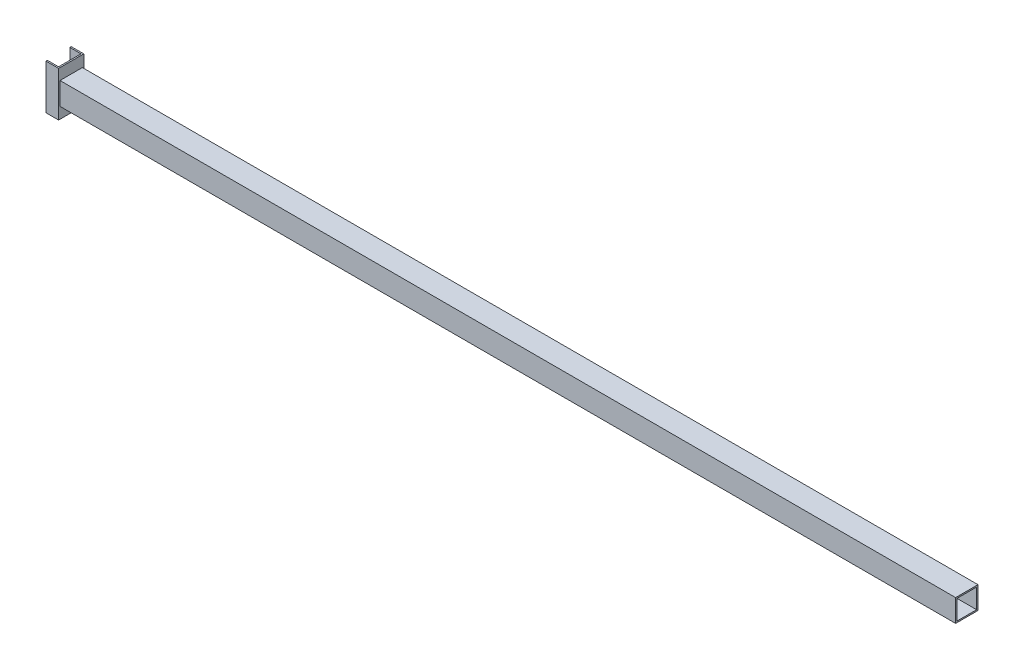
ISO-10303-21;
HEADER;
FILE_DESCRIPTION(('STEP AP214'),'2;1');
FILE_NAME('part.step','',(''),(''),'','','');
FILE_SCHEMA(('AUTOMOTIVE_DESIGN { 1 0 10303 214 1 1 1 1 }'));
ENDSEC;
DATA;
#1=APPLICATION_CONTEXT('core data for automotive mechanical design processes');
#2=APPLICATION_PROTOCOL_DEFINITION('international standard','automotive_design',2000,#1);
#3=PRODUCT_CONTEXT('',#1,'mechanical');
#4=PRODUCT('Part','Part','',(#3));
#5=PRODUCT_RELATED_PRODUCT_CATEGORY('part','',(#4));
#6=PRODUCT_DEFINITION_FORMATION('','',#4);
#7=PRODUCT_DEFINITION_CONTEXT('part definition',#1,'design');
#8=PRODUCT_DEFINITION('design','',#6,#7);
#9=PRODUCT_DEFINITION_SHAPE('','',#8);
#10=(LENGTH_UNIT() NAMED_UNIT(*) SI_UNIT(.MILLI.,.METRE.));
#11=(NAMED_UNIT(*) PLANE_ANGLE_UNIT() SI_UNIT($,.RADIAN.));
#12=(NAMED_UNIT(*) SI_UNIT($,.STERADIAN.) SOLID_ANGLE_UNIT());
#13=UNCERTAINTY_MEASURE_WITH_UNIT(LENGTH_MEASURE(1.E-05),#10,'distance_accuracy_value','');
#14=(GEOMETRIC_REPRESENTATION_CONTEXT(3) GLOBAL_UNCERTAINTY_ASSIGNED_CONTEXT((#13)) GLOBAL_UNIT_ASSIGNED_CONTEXT((#10,
#11,#12)) REPRESENTATION_CONTEXT('',''));
#15=CARTESIAN_POINT('',(0.,0.,0.));
#16=DIRECTION('',(0.,0.,1.));
#17=DIRECTION('',(1.,0.,0.));
#18=AXIS2_PLACEMENT_3D('',#15,#16,#17);
#19=CARTESIAN_POINT('',(-1.5875,0.,0.));
#20=DIRECTION('',(1.,0.,0.));
#21=DIRECTION('',(0.,0.,-1.));
#22=AXIS2_PLACEMENT_3D('',#19,#20,#21);
#23=PLANE('',#22);
#24=DIRECTION('',(0.,0.,1.));
#25=VECTOR('',#24,1.);
#26=CARTESIAN_POINT('',(-1.5875,19.05,-6.35000000000001));
#27=LINE('',#26,#25);
#28=CARTESIAN_POINT('',(-1.5875,19.05,-6.35000000000001));
#29=VERTEX_POINT('',#28);
#30=CARTESIAN_POINT('',(-1.5875,19.05,6.34999999999999));
#31=VERTEX_POINT('',#30);
#32=EDGE_CURVE('E215',#29,#31,#27,.T.);
#33=ORIENTED_EDGE('',*,*,#32,.T.);
#34=DIRECTION('',(0.,-1.,0.));
#35=VECTOR('',#34,1.);
#36=CARTESIAN_POINT('',(-1.5875,19.05,6.34999999999999));
#37=LINE('',#36,#35);
#38=CARTESIAN_POINT('',(-1.5875,12.7,6.34999999999999));
#39=VERTEX_POINT('',#38);
#40=EDGE_CURVE('E230',#31,#39,#37,.T.);
#41=ORIENTED_EDGE('',*,*,#40,.T.);
#42=DIRECTION('',(0.,0.,1.));
#43=VECTOR('',#42,1.);
#44=CARTESIAN_POINT('',(-1.5875,12.7,-6.35000000000001));
#45=LINE('',#44,#43);
#46=CARTESIAN_POINT('',(-1.5875,12.7,-6.35000000000001));
#47=VERTEX_POINT('',#46);
#48=EDGE_CURVE('E233',#47,#39,#45,.T.);
#49=ORIENTED_EDGE('',*,*,#48,.F.);
#50=DIRECTION('',(0.,-1.,0.));
#51=VECTOR('',#50,1.);
#52=CARTESIAN_POINT('',(-1.5875,19.05,-6.35000000000001));
#53=LINE('',#52,#51);
#54=EDGE_CURVE('E226',#29,#47,#53,.T.);
#55=ORIENTED_EDGE('',*,*,#54,.F.);
#56=EDGE_LOOP('',(#33,#41,#49,#55));
#57=FACE_BOUND('',#56,.T.);
#58=DIRECTION('',(0.,0.,-1.));
#59=VECTOR('',#58,1.);
#60=CARTESIAN_POINT('',(-1.5875,25.4,0.));
#61=LINE('',#60,#59);
#62=CARTESIAN_POINT('',(-1.5875,25.4,12.7));
#63=VERTEX_POINT('',#62);
#64=CARTESIAN_POINT('',(-1.5875,25.4,-12.7));
#65=VERTEX_POINT('',#64);
#66=EDGE_CURVE('E366',#63,#65,#61,.T.);
#67=ORIENTED_EDGE('',*,*,#66,.T.);
#68=DIRECTION('',(0.,-1.,0.));
#69=VECTOR('',#68,1.);
#70=CARTESIAN_POINT('',(-1.5875,0.,-12.7));
#71=LINE('',#70,#69);
#72=CARTESIAN_POINT('',(-1.5875,-25.4,-12.7));
#73=VERTEX_POINT('',#72);
#74=EDGE_CURVE('E337',#65,#73,#71,.T.);
#75=ORIENTED_EDGE('',*,*,#74,.T.);
#76=DIRECTION('',(0.,0.,-1.));
#77=VECTOR('',#76,1.);
#78=CARTESIAN_POINT('',(-1.5875,-25.4,0.));
#79=LINE('',#78,#77);
#80=CARTESIAN_POINT('',(-1.5875,-25.4,12.7));
#81=VERTEX_POINT('',#80);
#82=EDGE_CURVE('E363',#81,#73,#79,.T.);
#83=ORIENTED_EDGE('',*,*,#82,.F.);
#84=DIRECTION('',(0.,-1.,0.));
#85=VECTOR('',#84,1.);
#86=CARTESIAN_POINT('',(-1.5875,0.,12.7));
#87=LINE('',#86,#85);
#88=EDGE_CURVE('E357',#63,#81,#87,.T.);
#89=ORIENTED_EDGE('',*,*,#88,.F.);
#90=EDGE_LOOP('',(#67,#75,#83,#89));
#91=FACE_BOUND('',#90,.T.);
#92=DIRECTION('',(0.,0.,1.));
#93=VECTOR('',#92,1.);
#94=CARTESIAN_POINT('',(-1.5875,-6.35,-6.35000000000001));
#95=LINE('',#94,#93);
#96=CARTESIAN_POINT('',(-1.5875,-6.35,-6.35000000000002));
#97=VERTEX_POINT('',#96);
#98=CARTESIAN_POINT('',(-1.5875,-6.35,6.34999999999998));
#99=VERTEX_POINT('',#98);
#100=EDGE_CURVE('E55',#97,#99,#95,.T.);
#101=ORIENTED_EDGE('',*,*,#100,.T.);
#102=DIRECTION('',(0.,-1.,0.));
#103=VECTOR('',#102,1.);
#104=CARTESIAN_POINT('',(-1.5875,-6.35,6.34999999999999));
#105=LINE('',#104,#103);
#106=CARTESIAN_POINT('',(-1.5875,-12.7,6.34999999999999));
#107=VERTEX_POINT('',#106);
#108=EDGE_CURVE('E185',#99,#107,#105,.T.);
#109=ORIENTED_EDGE('',*,*,#108,.T.);
#110=DIRECTION('',(0.,0.,1.));
#111=VECTOR('',#110,1.);
#112=CARTESIAN_POINT('',(-1.5875,-12.7,-6.35000000000001));
#113=LINE('',#112,#111);
#114=CARTESIAN_POINT('',(-1.5875,-12.7,-6.35000000000001));
#115=VERTEX_POINT('',#114);
#116=EDGE_CURVE('E187',#115,#107,#113,.T.);
#117=ORIENTED_EDGE('',*,*,#116,.F.);
#118=DIRECTION('',(0.,-1.,0.));
#119=VECTOR('',#118,1.);
#120=CARTESIAN_POINT('',(-1.5875,-6.35,-6.35000000000001));
#121=LINE('',#120,#119);
#122=EDGE_CURVE('E60',#97,#115,#121,.T.);
#123=ORIENTED_EDGE('',*,*,#122,.F.);
#124=EDGE_LOOP('',(#101,#109,#117,#123));
#125=FACE_BOUND('',#124,.T.);
#126=ADVANCED_FACE('F38',(#57,#91,#125),#23,.F.);
#127=CARTESIAN_POINT('',(0.,0.,0.));
#128=DIRECTION('',(1.,0.,0.));
#129=DIRECTION('',(0.,0.,-1.));
#130=AXIS2_PLACEMENT_3D('',#127,#128,#129);
#131=PLANE('',#130);
#132=DIRECTION('',(0.,0.,-1.));
#133=VECTOR('',#132,1.);
#134=CARTESIAN_POINT('',(0.,12.7,0.));
#135=LINE('',#134,#133);
#136=CARTESIAN_POINT('',(0.,12.7,12.7));
#137=VERTEX_POINT('',#136);
#138=CARTESIAN_POINT('',(0.,12.7,-12.7));
#139=VERTEX_POINT('',#138);
#140=EDGE_CURVE('E229',#137,#139,#135,.T.);
#141=ORIENTED_EDGE('',*,*,#140,.T.);
#142=DIRECTION('',(0.,-1.,0.));
#143=VECTOR('',#142,1.);
#144=CARTESIAN_POINT('',(0.,0.,-12.7));
#145=LINE('',#144,#143);
#146=CARTESIAN_POINT('',(0.,-12.7,-12.7));
#147=VERTEX_POINT('',#146);
#148=EDGE_CURVE('E288',#139,#147,#145,.T.);
#149=ORIENTED_EDGE('',*,*,#148,.T.);
#150=DIRECTION('',(0.,0.,-1.));
#151=VECTOR('',#150,1.);
#152=CARTESIAN_POINT('',(0.,-12.7,0.));
#153=LINE('',#152,#151);
#154=CARTESIAN_POINT('',(0.,-12.7,12.7));
#155=VERTEX_POINT('',#154);
#156=EDGE_CURVE('E285',#155,#147,#153,.T.);
#157=ORIENTED_EDGE('',*,*,#156,.F.);
#158=DIRECTION('',(0.,-1.,0.));
#159=VECTOR('',#158,1.);
#160=CARTESIAN_POINT('',(0.,0.,12.7));
#161=LINE('',#160,#159);
#162=EDGE_CURVE('E282',#137,#155,#161,.T.);
#163=ORIENTED_EDGE('',*,*,#162,.F.);
#164=EDGE_LOOP('',(#141,#149,#157,#163));
#165=FACE_BOUND('',#164,.T.);
#166=DIRECTION('',(0.,0.,-1.));
#167=VECTOR('',#166,1.);
#168=CARTESIAN_POINT('',(0.,-25.4,0.));
#169=LINE('',#168,#167);
#170=CARTESIAN_POINT('',(0.,-25.4,14.2875));
#171=VERTEX_POINT('',#170);
#172=CARTESIAN_POINT('',(0.,-25.4,-14.2875));
#173=VERTEX_POINT('',#172);
#174=EDGE_CURVE('E372',#171,#173,#169,.T.);
#175=ORIENTED_EDGE('',*,*,#174,.T.);
#176=DIRECTION('',(0.,1.,0.));
#177=VECTOR('',#176,1.);
#178=CARTESIAN_POINT('',(0.,0.,-14.2875));
#179=LINE('',#178,#177);
#180=CARTESIAN_POINT('',(0.,25.4,-14.2875));
#181=VERTEX_POINT('',#180);
#182=EDGE_CURVE('E374',#173,#181,#179,.T.);
#183=ORIENTED_EDGE('',*,*,#182,.T.);
#184=DIRECTION('',(0.,0.,-1.));
#185=VECTOR('',#184,1.);
#186=CARTESIAN_POINT('',(0.,25.4,0.));
#187=LINE('',#186,#185);
#188=CARTESIAN_POINT('',(0.,25.4,14.2875));
#189=VERTEX_POINT('',#188);
#190=EDGE_CURVE('E367',#189,#181,#187,.T.);
#191=ORIENTED_EDGE('',*,*,#190,.F.);
#192=DIRECTION('',(0.,1.,0.));
#193=VECTOR('',#192,1.);
#194=CARTESIAN_POINT('',(0.,0.,14.2875));
#195=LINE('',#194,#193);
#196=EDGE_CURVE('E362',#171,#189,#195,.T.);
#197=ORIENTED_EDGE('',*,*,#196,.F.);
#198=EDGE_LOOP('',(#175,#183,#191,#197));
#199=FACE_BOUND('',#198,.T.);
#200=ADVANCED_FACE('F389',(#165,#199),#131,.T.);
#201=CARTESIAN_POINT('',(-1.5875,0.,14.2875));
#202=DIRECTION('',(0.,0.,-1.));
#203=DIRECTION('',(-1.,0.,0.));
#204=AXIS2_PLACEMENT_3D('',#201,#202,#203);
#205=PLANE('',#204);
#206=ORIENTED_EDGE('',*,*,#196,.T.);
#207=DIRECTION('',(1.,0.,0.));
#208=VECTOR('',#207,1.);
#209=CARTESIAN_POINT('',(-1.5875,25.4,14.2875));
#210=LINE('',#209,#208);
#211=CARTESIAN_POINT('',(-14.2875,25.4,14.2875));
#212=VERTEX_POINT('',#211);
#213=EDGE_CURVE('E12',#212,#189,#210,.T.);
#214=ORIENTED_EDGE('',*,*,#213,.F.);
#215=DIRECTION('',(0.,1.,0.));
#216=VECTOR('',#215,1.);
#217=CARTESIAN_POINT('',(-14.2875,0.,14.2875));
#218=LINE('',#217,#216);
#219=CARTESIAN_POINT('',(-14.2875,-25.4,14.2875));
#220=VERTEX_POINT('',#219);
#221=EDGE_CURVE('E345',#220,#212,#218,.T.);
#222=ORIENTED_EDGE('',*,*,#221,.F.);
#223=DIRECTION('',(1.,0.,0.));
#224=VECTOR('',#223,1.);
#225=CARTESIAN_POINT('',(-1.5875,-25.4,14.2875));
#226=LINE('',#225,#224);
#227=EDGE_CURVE('E42',#220,#171,#226,.T.);
#228=ORIENTED_EDGE('',*,*,#227,.T.);
#229=EDGE_LOOP('',(#206,#214,#222,#228));
#230=FACE_BOUND('',#229,.T.);
#231=ADVANCED_FACE('F40',(#230),#205,.F.);
#232=CARTESIAN_POINT('',(-1.5875,25.4,0.));
#233=DIRECTION('',(0.,-1.,0.));
#234=DIRECTION('',(0.,0.,-1.));
#235=AXIS2_PLACEMENT_3D('',#232,#233,#234);
#236=PLANE('',#235);
#237=ORIENTED_EDGE('',*,*,#190,.T.);
#238=DIRECTION('',(1.,0.,0.));
#239=VECTOR('',#238,1.);
#240=CARTESIAN_POINT('',(-1.5875,25.4,-14.2875));
#241=LINE('',#240,#239);
#242=CARTESIAN_POINT('',(-14.2875,25.4,-14.2875));
#243=VERTEX_POINT('',#242);
#244=EDGE_CURVE('E47',#243,#181,#241,.T.);
#245=ORIENTED_EDGE('',*,*,#244,.F.);
#246=DIRECTION('',(0.,0.,-1.));
#247=VECTOR('',#246,1.);
#248=CARTESIAN_POINT('',(-14.2875,25.4,0.));
#249=LINE('',#248,#247);
#250=CARTESIAN_POINT('',(-14.2875,25.4,-12.7));
#251=VERTEX_POINT('',#250);
#252=EDGE_CURVE('E312',#251,#243,#249,.T.);
#253=ORIENTED_EDGE('',*,*,#252,.F.);
#254=DIRECTION('',(1.,0.,0.));
#255=VECTOR('',#254,1.);
#256=CARTESIAN_POINT('',(-14.2875,25.4,-12.7));
#257=LINE('',#256,#255);
#258=EDGE_CURVE('E334',#251,#65,#257,.T.);
#259=ORIENTED_EDGE('',*,*,#258,.T.);
#260=ORIENTED_EDGE('',*,*,#66,.F.);
#261=DIRECTION('',(1.,0.,0.));
#262=VECTOR('',#261,1.);
#263=CARTESIAN_POINT('',(-14.2875,25.4,12.7));
#264=LINE('',#263,#262);
#265=CARTESIAN_POINT('',(-14.2875,25.4,12.7));
#266=VERTEX_POINT('',#265);
#267=EDGE_CURVE('E354',#266,#63,#264,.T.);
#268=ORIENTED_EDGE('',*,*,#267,.F.);
#269=DIRECTION('',(0.,0.,-1.));
#270=VECTOR('',#269,1.);
#271=CARTESIAN_POINT('',(-14.2875,25.4,0.));
#272=LINE('',#271,#270);
#273=EDGE_CURVE('E342',#212,#266,#272,.T.);
#274=ORIENTED_EDGE('',*,*,#273,.F.);
#275=ORIENTED_EDGE('',*,*,#213,.T.);
#276=EDGE_LOOP('',(#237,#245,#253,#259,#260,#268,#274,#275));
#277=FACE_BOUND('',#276,.T.);
#278=ADVANCED_FACE('F401',(#277),#236,.F.);
#279=CARTESIAN_POINT('',(-1.5875,0.,-14.2875));
#280=DIRECTION('',(0.,0.,-1.));
#281=DIRECTION('',(-1.,0.,0.));
#282=AXIS2_PLACEMENT_3D('',#279,#280,#281);
#283=PLANE('',#282);
#284=ORIENTED_EDGE('',*,*,#182,.F.);
#285=DIRECTION('',(1.,0.,0.));
#286=VECTOR('',#285,1.);
#287=CARTESIAN_POINT('',(-1.5875,-25.4,-14.2875));
#288=LINE('',#287,#286);
#289=CARTESIAN_POINT('',(-14.2875,-25.4,-14.2875));
#290=VERTEX_POINT('',#289);
#291=EDGE_CURVE('E379',#290,#173,#288,.T.);
#292=ORIENTED_EDGE('',*,*,#291,.F.);
#293=DIRECTION('',(0.,1.,0.));
#294=VECTOR('',#293,1.);
#295=CARTESIAN_POINT('',(-14.2875,0.,-14.2875));
#296=LINE('',#295,#294);
#297=EDGE_CURVE('E331',#290,#243,#296,.T.);
#298=ORIENTED_EDGE('',*,*,#297,.T.);
#299=ORIENTED_EDGE('',*,*,#244,.T.);
#300=EDGE_LOOP('',(#284,#292,#298,#299));
#301=FACE_BOUND('',#300,.T.);
#302=ADVANCED_FACE('F393',(#301),#283,.T.);
#303=CARTESIAN_POINT('',(-1.5875,-25.4,0.));
#304=DIRECTION('',(0.,-1.,0.));
#305=DIRECTION('',(0.,0.,-1.));
#306=AXIS2_PLACEMENT_3D('',#303,#304,#305);
#307=PLANE('',#306);
#308=ORIENTED_EDGE('',*,*,#82,.T.);
#309=DIRECTION('',(1.,0.,0.));
#310=VECTOR('',#309,1.);
#311=CARTESIAN_POINT('',(-14.2875,-25.4,-12.7));
#312=LINE('',#311,#310);
#313=CARTESIAN_POINT('',(-14.2875,-25.4,-12.7));
#314=VERTEX_POINT('',#313);
#315=EDGE_CURVE('E335',#314,#73,#312,.T.);
#316=ORIENTED_EDGE('',*,*,#315,.F.);
#317=DIRECTION('',(0.,0.,-1.));
#318=VECTOR('',#317,1.);
#319=CARTESIAN_POINT('',(-14.2875,-25.4,0.));
#320=LINE('',#319,#318);
#321=EDGE_CURVE('E328',#314,#290,#320,.T.);
#322=ORIENTED_EDGE('',*,*,#321,.T.);
#323=ORIENTED_EDGE('',*,*,#291,.T.);
#324=ORIENTED_EDGE('',*,*,#174,.F.);
#325=ORIENTED_EDGE('',*,*,#227,.F.);
#326=DIRECTION('',(0.,0.,-1.));
#327=VECTOR('',#326,1.);
#328=CARTESIAN_POINT('',(-14.2875,-25.4,0.));
#329=LINE('',#328,#327);
#330=CARTESIAN_POINT('',(-14.2875,-25.4,12.7));
#331=VERTEX_POINT('',#330);
#332=EDGE_CURVE('E348',#220,#331,#329,.T.);
#333=ORIENTED_EDGE('',*,*,#332,.T.);
#334=DIRECTION('',(1.,0.,0.));
#335=VECTOR('',#334,1.);
#336=CARTESIAN_POINT('',(-14.2875,-25.4,12.7));
#337=LINE('',#336,#335);
#338=EDGE_CURVE('E353',#331,#81,#337,.T.);
#339=ORIENTED_EDGE('',*,*,#338,.T.);
#340=EDGE_LOOP('',(#308,#316,#322,#323,#324,#325,#333,#339));
#341=FACE_BOUND('',#340,.T.);
#342=ADVANCED_FACE('F390',(#341),#307,.T.);
#343=CARTESIAN_POINT('',(-14.2875,0.,12.7));
#344=DIRECTION('',(0.,0.,1.));
#345=DIRECTION('',(0.,-1.,0.));
#346=AXIS2_PLACEMENT_3D('',#343,#344,#345);
#347=PLANE('',#346);
#348=ORIENTED_EDGE('',*,*,#267,.T.);
#349=ORIENTED_EDGE('',*,*,#88,.T.);
#350=ORIENTED_EDGE('',*,*,#338,.F.);
#351=DIRECTION('',(0.,-1.,0.));
#352=VECTOR('',#351,1.);
#353=CARTESIAN_POINT('',(-14.2875,0.,12.7));
#354=LINE('',#353,#352);
#355=EDGE_CURVE('E351',#266,#331,#354,.T.);
#356=ORIENTED_EDGE('',*,*,#355,.F.);
#357=EDGE_LOOP('',(#348,#349,#350,#356));
#358=FACE_BOUND('',#357,.T.);
#359=ADVANCED_FACE('F392',(#358),#347,.F.);
#360=CARTESIAN_POINT('',(-14.2875,0.,0.));
#361=DIRECTION('',(1.,0.,0.));
#362=DIRECTION('',(0.,0.,-1.));
#363=AXIS2_PLACEMENT_3D('',#360,#361,#362);
#364=PLANE('',#363);
#365=ORIENTED_EDGE('',*,*,#273,.T.);
#366=ORIENTED_EDGE('',*,*,#355,.T.);
#367=ORIENTED_EDGE('',*,*,#332,.F.);
#368=ORIENTED_EDGE('',*,*,#221,.T.);
#369=EDGE_LOOP('',(#365,#366,#367,#368));
#370=FACE_BOUND('',#369,.T.);
#371=ADVANCED_FACE('F398',(#370),#364,.F.);
#372=CARTESIAN_POINT('',(-14.2875,0.,-12.7));
#373=DIRECTION('',(0.,0.,1.));
#374=DIRECTION('',(0.,-1.,0.));
#375=AXIS2_PLACEMENT_3D('',#372,#373,#374);
#376=PLANE('',#375);
#377=ORIENTED_EDGE('',*,*,#74,.F.);
#378=ORIENTED_EDGE('',*,*,#258,.F.);
#379=DIRECTION('',(0.,-1.,0.));
#380=VECTOR('',#379,1.);
#381=CARTESIAN_POINT('',(-14.2875,0.,-12.7));
#382=LINE('',#381,#380);
#383=EDGE_CURVE('E325',#251,#314,#382,.T.);
#384=ORIENTED_EDGE('',*,*,#383,.T.);
#385=ORIENTED_EDGE('',*,*,#315,.T.);
#386=EDGE_LOOP('',(#377,#378,#384,#385));
#387=FACE_BOUND('',#386,.T.);
#388=ADVANCED_FACE('F439',(#387),#376,.T.);
#389=CARTESIAN_POINT('',(-14.2875,0.,0.));
#390=DIRECTION('',(1.,0.,0.));
#391=DIRECTION('',(0.,0.,-1.));
#392=AXIS2_PLACEMENT_3D('',#389,#390,#391);
#393=PLANE('',#392);
#394=ORIENTED_EDGE('',*,*,#252,.T.);
#395=ORIENTED_EDGE('',*,*,#297,.F.);
#396=ORIENTED_EDGE('',*,*,#321,.F.);
#397=ORIENTED_EDGE('',*,*,#383,.F.);
#398=EDGE_LOOP('',(#394,#395,#396,#397));
#399=FACE_BOUND('',#398,.T.);
#400=ADVANCED_FACE('F431',(#399),#393,.F.);
#401=CARTESIAN_POINT('',(1016.,-11.1125,0.));
#402=DIRECTION('',(0.,1.,0.));
#403=DIRECTION('',(0.,0.,1.));
#404=AXIS2_PLACEMENT_3D('',#401,#402,#403);
#405=PLANE('',#404);
#406=DIRECTION('',(0.,0.,-1.));
#407=VECTOR('',#406,1.);
#408=CARTESIAN_POINT('',(0.,-11.1125,0.));
#409=LINE('',#408,#407);
#410=CARTESIAN_POINT('',(0.,-11.1125,11.1125));
#411=VERTEX_POINT('',#410);
#412=CARTESIAN_POINT('',(0.,-11.1125,-11.1125));
#413=VERTEX_POINT('',#412);
#414=EDGE_CURVE('E290',#411,#413,#409,.T.);
#415=ORIENTED_EDGE('',*,*,#414,.F.);
#416=DIRECTION('',(-1.,0.,0.));
#417=VECTOR('',#416,1.);
#418=CARTESIAN_POINT('',(1016.,-11.1125,11.1125));
#419=LINE('',#418,#417);
#420=CARTESIAN_POINT('',(1016.,-11.1125,11.1125));
#421=VERTEX_POINT('',#420);
#422=EDGE_CURVE('E309',#421,#411,#419,.T.);
#423=ORIENTED_EDGE('',*,*,#422,.F.);
#424=DIRECTION('',(0.,0.,-1.));
#425=VECTOR('',#424,1.);
#426=CARTESIAN_POINT('',(1016.,-11.1125,0.));
#427=LINE('',#426,#425);
#428=CARTESIAN_POINT('',(1016.,-11.1125,-11.1125));
#429=VERTEX_POINT('',#428);
#430=EDGE_CURVE('E269',#421,#429,#427,.T.);
#431=ORIENTED_EDGE('',*,*,#430,.T.);
#432=DIRECTION('',(-1.,0.,0.));
#433=VECTOR('',#432,1.);
#434=CARTESIAN_POINT('',(1016.,-11.1125,-11.1125));
#435=LINE('',#434,#433);
#436=EDGE_CURVE('E299',#429,#413,#435,.T.);
#437=ORIENTED_EDGE('',*,*,#436,.T.);
#438=EDGE_LOOP('',(#415,#423,#431,#437));
#439=FACE_BOUND('',#438,.T.);
#440=ADVANCED_FACE('F447',(#439),#405,.T.);
#441=CARTESIAN_POINT('',(1016.,0.,11.1125));
#442=DIRECTION('',(0.,0.,1.));
#443=DIRECTION('',(1.,0.,0.));
#444=AXIS2_PLACEMENT_3D('',#441,#442,#443);
#445=PLANE('',#444);
#446=DIRECTION('',(0.,1.,0.));
#447=VECTOR('',#446,1.);
#448=CARTESIAN_POINT('',(0.,0.,11.1125));
#449=LINE('',#448,#447);
#450=CARTESIAN_POINT('',(0.,11.1125,11.1125));
#451=VERTEX_POINT('',#450);
#452=EDGE_CURVE('E292',#411,#451,#449,.T.);
#453=ORIENTED_EDGE('',*,*,#452,.T.);
#454=DIRECTION('',(-1.,0.,0.));
#455=VECTOR('',#454,1.);
#456=CARTESIAN_POINT('',(1016.,11.1125,11.1125));
#457=LINE('',#456,#455);
#458=CARTESIAN_POINT('',(1016.,11.1125,11.1125));
#459=VERTEX_POINT('',#458);
#460=EDGE_CURVE('E306',#459,#451,#457,.T.);
#461=ORIENTED_EDGE('',*,*,#460,.F.);
#462=DIRECTION('',(0.,1.,0.));
#463=VECTOR('',#462,1.);
#464=CARTESIAN_POINT('',(1016.,0.,11.1125));
#465=LINE('',#464,#463);
#466=EDGE_CURVE('E272',#421,#459,#465,.T.);
#467=ORIENTED_EDGE('',*,*,#466,.F.);
#468=ORIENTED_EDGE('',*,*,#422,.T.);
#469=EDGE_LOOP('',(#453,#461,#467,#468));
#470=FACE_BOUND('',#469,.T.);
#471=ADVANCED_FACE('F468',(#470),#445,.F.);
#472=CARTESIAN_POINT('',(1016.,11.1125,0.));
#473=DIRECTION('',(0.,1.,0.));
#474=DIRECTION('',(0.,0.,1.));
#475=AXIS2_PLACEMENT_3D('',#472,#473,#474);
#476=PLANE('',#475);
#477=DIRECTION('',(0.,0.,-1.));
#478=VECTOR('',#477,1.);
#479=CARTESIAN_POINT('',(0.,11.1125,0.));
#480=LINE('',#479,#478);
#481=CARTESIAN_POINT('',(0.,11.1125,-11.1125));
#482=VERTEX_POINT('',#481);
#483=EDGE_CURVE('E295',#451,#482,#480,.T.);
#484=ORIENTED_EDGE('',*,*,#483,.T.);
#485=DIRECTION('',(-1.,0.,0.));
#486=VECTOR('',#485,1.);
#487=CARTESIAN_POINT('',(1016.,11.1125,-11.1125));
#488=LINE('',#487,#486);
#489=CARTESIAN_POINT('',(1016.,11.1125,-11.1125));
#490=VERTEX_POINT('',#489);
#491=EDGE_CURVE('E302',#490,#482,#488,.T.);
#492=ORIENTED_EDGE('',*,*,#491,.F.);
#493=DIRECTION('',(0.,0.,-1.));
#494=VECTOR('',#493,1.);
#495=CARTESIAN_POINT('',(1016.,11.1125,0.));
#496=LINE('',#495,#494);
#497=EDGE_CURVE('E275',#459,#490,#496,.T.);
#498=ORIENTED_EDGE('',*,*,#497,.F.);
#499=ORIENTED_EDGE('',*,*,#460,.T.);
#500=EDGE_LOOP('',(#484,#492,#498,#499));
#501=FACE_BOUND('',#500,.T.);
#502=ADVANCED_FACE('F452',(#501),#476,.F.);
#503=CARTESIAN_POINT('',(1016.,12.7,0.));
#504=DIRECTION('',(0.,1.,0.));
#505=DIRECTION('',(0.,0.,1.));
#506=AXIS2_PLACEMENT_3D('',#503,#504,#505);
#507=PLANE('',#506);
#508=ORIENTED_EDGE('',*,*,#140,.F.);
#509=DIRECTION('',(-1.,0.,0.));
#510=VECTOR('',#509,1.);
#511=CARTESIAN_POINT('',(1016.,12.7,12.7));
#512=LINE('',#511,#510);
#513=CARTESIAN_POINT('',(1016.,12.7,12.7));
#514=VERTEX_POINT('',#513);
#515=EDGE_CURVE('E303',#514,#137,#512,.T.);
#516=ORIENTED_EDGE('',*,*,#515,.F.);
#517=DIRECTION('',(0.,0.,-1.));
#518=VECTOR('',#517,1.);
#519=CARTESIAN_POINT('',(1016.,12.7,0.));
#520=LINE('',#519,#518);
#521=CARTESIAN_POINT('',(1016.,12.7,-12.7));
#522=VERTEX_POINT('',#521);
#523=EDGE_CURVE('E258',#514,#522,#520,.T.);
#524=ORIENTED_EDGE('',*,*,#523,.T.);
#525=DIRECTION('',(-1.,0.,0.));
#526=VECTOR('',#525,1.);
#527=CARTESIAN_POINT('',(1016.,12.7,-12.7));
#528=LINE('',#527,#526);
#529=EDGE_CURVE('E280',#522,#139,#528,.T.);
#530=ORIENTED_EDGE('',*,*,#529,.T.);
#531=EDGE_LOOP('',(#508,#516,#524,#530));
#532=FACE_BOUND('',#531,.T.);
#533=ADVANCED_FACE('F448',(#532),#507,.T.);
#534=CARTESIAN_POINT('',(1016.,0.,12.7));
#535=DIRECTION('',(0.,0.,-1.));
#536=DIRECTION('',(0.,1.,0.));
#537=AXIS2_PLACEMENT_3D('',#534,#535,#536);
#538=PLANE('',#537);
#539=ORIENTED_EDGE('',*,*,#162,.T.);
#540=DIRECTION('',(-1.,0.,0.));
#541=VECTOR('',#540,1.);
#542=CARTESIAN_POINT('',(1016.,-12.7,12.7));
#543=LINE('',#542,#541);
#544=CARTESIAN_POINT('',(1016.,-12.7,12.7));
#545=VERTEX_POINT('',#544);
#546=EDGE_CURVE('E318',#545,#155,#543,.T.);
#547=ORIENTED_EDGE('',*,*,#546,.F.);
#548=DIRECTION('',(0.,-1.,0.));
#549=VECTOR('',#548,1.);
#550=CARTESIAN_POINT('',(1016.,0.,12.7));
#551=LINE('',#550,#549);
#552=EDGE_CURVE('E261',#514,#545,#551,.T.);
#553=ORIENTED_EDGE('',*,*,#552,.F.);
#554=ORIENTED_EDGE('',*,*,#515,.T.);
#555=EDGE_LOOP('',(#539,#547,#553,#554));
#556=FACE_BOUND('',#555,.T.);
#557=ADVANCED_FACE('F451',(#556),#538,.F.);
#558=CARTESIAN_POINT('',(1016.,-12.7,0.));
#559=DIRECTION('',(0.,1.,0.));
#560=DIRECTION('',(0.,0.,1.));
#561=AXIS2_PLACEMENT_3D('',#558,#559,#560);
#562=PLANE('',#561);
#563=ORIENTED_EDGE('',*,*,#156,.T.);
#564=DIRECTION('',(-1.,0.,0.));
#565=VECTOR('',#564,1.);
#566=CARTESIAN_POINT('',(1016.,-12.7,-12.7));
#567=LINE('',#566,#565);
#568=CARTESIAN_POINT('',(1016.,-12.7,-12.7));
#569=VERTEX_POINT('',#568);
#570=EDGE_CURVE('E315',#569,#147,#567,.T.);
#571=ORIENTED_EDGE('',*,*,#570,.F.);
#572=DIRECTION('',(0.,0.,-1.));
#573=VECTOR('',#572,1.);
#574=CARTESIAN_POINT('',(1016.,-12.7,0.));
#575=LINE('',#574,#573);
#576=EDGE_CURVE('E264',#545,#569,#575,.T.);
#577=ORIENTED_EDGE('',*,*,#576,.F.);
#578=ORIENTED_EDGE('',*,*,#546,.T.);
#579=EDGE_LOOP('',(#563,#571,#577,#578));
#580=FACE_BOUND('',#579,.T.);
#581=ADVANCED_FACE('F456',(#580),#562,.F.);
#582=CARTESIAN_POINT('',(1016.,0.,-12.7));
#583=DIRECTION('',(0.,0.,-1.));
#584=DIRECTION('',(0.,1.,0.));
#585=AXIS2_PLACEMENT_3D('',#582,#583,#584);
#586=PLANE('',#585);
#587=ORIENTED_EDGE('',*,*,#148,.F.);
#588=ORIENTED_EDGE('',*,*,#529,.F.);
#589=DIRECTION('',(0.,-1.,0.));
#590=VECTOR('',#589,1.);
#591=CARTESIAN_POINT('',(1016.,0.,-12.7));
#592=LINE('',#591,#590);
#593=EDGE_CURVE('E266',#522,#569,#592,.T.);
#594=ORIENTED_EDGE('',*,*,#593,.T.);
#595=ORIENTED_EDGE('',*,*,#570,.T.);
#596=EDGE_LOOP('',(#587,#588,#594,#595));
#597=FACE_BOUND('',#596,.T.);
#598=ADVANCED_FACE('F460',(#597),#586,.T.);
#599=CARTESIAN_POINT('',(1016.,0.,-11.1125));
#600=DIRECTION('',(0.,0.,1.));
#601=DIRECTION('',(1.,0.,0.));
#602=AXIS2_PLACEMENT_3D('',#599,#600,#601);
#603=PLANE('',#602);
#604=DIRECTION('',(0.,1.,0.));
#605=VECTOR('',#604,1.);
#606=CARTESIAN_POINT('',(0.,0.,-11.1125));
#607=LINE('',#606,#605);
#608=EDGE_CURVE('E262',#413,#482,#607,.T.);
#609=ORIENTED_EDGE('',*,*,#608,.F.);
#610=ORIENTED_EDGE('',*,*,#436,.F.);
#611=DIRECTION('',(0.,1.,0.));
#612=VECTOR('',#611,1.);
#613=CARTESIAN_POINT('',(1016.,0.,-11.1125));
#614=LINE('',#613,#612);
#615=EDGE_CURVE('E277',#429,#490,#614,.T.);
#616=ORIENTED_EDGE('',*,*,#615,.T.);
#617=ORIENTED_EDGE('',*,*,#491,.T.);
#618=EDGE_LOOP('',(#609,#610,#616,#617));
#619=FACE_BOUND('',#618,.T.);
#620=ADVANCED_FACE('F464',(#619),#603,.T.);
#621=CARTESIAN_POINT('',(1016.,0.,0.));
#622=DIRECTION('',(1.,0.,0.));
#623=DIRECTION('',(0.,0.,-1.));
#624=AXIS2_PLACEMENT_3D('',#621,#622,#623);
#625=PLANE('',#624);
#626=ORIENTED_EDGE('',*,*,#523,.F.);
#627=ORIENTED_EDGE('',*,*,#552,.T.);
#628=ORIENTED_EDGE('',*,*,#576,.T.);
#629=ORIENTED_EDGE('',*,*,#593,.F.);
#630=EDGE_LOOP('',(#626,#627,#628,#629));
#631=FACE_BOUND('',#630,.T.);
#632=ORIENTED_EDGE('',*,*,#430,.F.);
#633=ORIENTED_EDGE('',*,*,#466,.T.);
#634=ORIENTED_EDGE('',*,*,#497,.T.);
#635=ORIENTED_EDGE('',*,*,#615,.F.);
#636=EDGE_LOOP('',(#632,#633,#634,#635));
#637=FACE_BOUND('',#636,.T.);
#638=ADVANCED_FACE('F418',(#631,#637),#625,.T.);
#639=ORIENTED_EDGE('',*,*,#414,.T.);
#640=ORIENTED_EDGE('',*,*,#608,.T.);
#641=ORIENTED_EDGE('',*,*,#483,.F.);
#642=ORIENTED_EDGE('',*,*,#452,.F.);
#643=EDGE_LOOP('',(#639,#640,#641,#642));
#644=FACE_BOUND('',#643,.T.);
#645=ADVANCED_FACE('F412',(#644),#131,.T.);
#646=CARTESIAN_POINT('',(0.,0.,6.34999999999999));
#647=DIRECTION('',(0.,0.,1.));
#648=DIRECTION('',(1.,0.,0.));
#649=AXIS2_PLACEMENT_3D('',#646,#647,#648);
#650=PLANE('',#649);
#651=ORIENTED_EDGE('',*,*,#40,.F.);
#652=DIRECTION('',(0.447213595499958,0.894427190999916,0.));
#653=VECTOR('',#652,1.);
#654=CARTESIAN_POINT('',(-4.7625,12.7,6.34999999999999));
#655=LINE('',#654,#653);
#656=CARTESIAN_POINT('',(-4.7625,12.7,6.34999999999999));
#657=VERTEX_POINT('',#656);
#658=EDGE_CURVE('E243',#657,#31,#655,.T.);
#659=ORIENTED_EDGE('',*,*,#658,.F.);
#660=DIRECTION('',(-1.,0.,0.));
#661=VECTOR('',#660,1.);
#662=CARTESIAN_POINT('',(-1.5875,12.7,6.34999999999999));
#663=LINE('',#662,#661);
#664=EDGE_CURVE('E217',#39,#657,#663,.T.);
#665=ORIENTED_EDGE('',*,*,#664,.F.);
#666=EDGE_LOOP('',(#651,#659,#665));
#667=FACE_BOUND('',#666,.T.);
#668=ADVANCED_FACE('F417',(#667),#650,.T.);
#669=CARTESIAN_POINT('',(0.,0.,-6.35000000000001));
#670=DIRECTION('',(0.,0.,1.));
#671=DIRECTION('',(1.,0.,0.));
#672=AXIS2_PLACEMENT_3D('',#669,#670,#671);
#673=PLANE('',#672);
#674=ORIENTED_EDGE('',*,*,#54,.T.);
#675=DIRECTION('',(-1.,0.,0.));
#676=VECTOR('',#675,1.);
#677=CARTESIAN_POINT('',(-1.5875,12.7,-6.35000000000001));
#678=LINE('',#677,#676);
#679=CARTESIAN_POINT('',(-4.7625,12.7,-6.35000000000001));
#680=VERTEX_POINT('',#679);
#681=EDGE_CURVE('E236',#47,#680,#678,.T.);
#682=ORIENTED_EDGE('',*,*,#681,.T.);
#683=DIRECTION('',(0.447213595499958,0.894427190999916,0.));
#684=VECTOR('',#683,1.);
#685=CARTESIAN_POINT('',(-4.7625,12.7,-6.35000000000001));
#686=LINE('',#685,#684);
#687=EDGE_CURVE('E218',#680,#29,#686,.T.);
#688=ORIENTED_EDGE('',*,*,#687,.T.);
#689=EDGE_LOOP('',(#674,#682,#688));
#690=FACE_BOUND('',#689,.T.);
#691=ADVANCED_FACE('F484',(#690),#673,.F.);
#692=CARTESIAN_POINT('',(-4.7625,12.7,-6.35000000000001));
#693=DIRECTION('',(0.894427190999916,-0.447213595499958,0.));
#694=DIRECTION('',(0.447213595499958,0.894427190999916,0.));
#695=AXIS2_PLACEMENT_3D('',#692,#693,#694);
#696=PLANE('',#695);
#697=ORIENTED_EDGE('',*,*,#658,.T.);
#698=ORIENTED_EDGE('',*,*,#32,.F.);
#699=ORIENTED_EDGE('',*,*,#687,.F.);
#700=DIRECTION('',(0.,0.,1.));
#701=VECTOR('',#700,1.);
#702=CARTESIAN_POINT('',(-4.7625,12.7,-6.35000000000001));
#703=LINE('',#702,#701);
#704=EDGE_CURVE('E223',#680,#657,#703,.T.);
#705=ORIENTED_EDGE('',*,*,#704,.T.);
#706=EDGE_LOOP('',(#697,#698,#699,#705));
#707=FACE_BOUND('',#706,.T.);
#708=ADVANCED_FACE('F488',(#707),#696,.F.);
#709=CARTESIAN_POINT('',(-1.5875,12.7,-6.35000000000001));
#710=DIRECTION('',(0.,1.,0.));
#711=DIRECTION('',(-1.,0.,0.));
#712=AXIS2_PLACEMENT_3D('',#709,#710,#711);
#713=PLANE('',#712);
#714=ORIENTED_EDGE('',*,*,#664,.T.);
#715=ORIENTED_EDGE('',*,*,#704,.F.);
#716=ORIENTED_EDGE('',*,*,#681,.F.);
#717=ORIENTED_EDGE('',*,*,#48,.T.);
#718=EDGE_LOOP('',(#714,#715,#716,#717));
#719=FACE_BOUND('',#718,.T.);
#720=ADVANCED_FACE('F420',(#719),#713,.F.);
#721=CARTESIAN_POINT('',(0.,0.,6.34999999999998));
#722=DIRECTION('',(0.,0.,1.));
#723=DIRECTION('',(1.,0.,0.));
#724=AXIS2_PLACEMENT_3D('',#721,#722,#723);
#725=PLANE('',#724);
#726=ORIENTED_EDGE('',*,*,#108,.F.);
#727=DIRECTION('',(0.447213595499958,0.894427190999916,0.));
#728=VECTOR('',#727,1.);
#729=CARTESIAN_POINT('',(-4.7625,-12.7,6.34999999999999));
#730=LINE('',#729,#728);
#731=CARTESIAN_POINT('',(-4.7625,-12.7,6.34999999999999));
#732=VERTEX_POINT('',#731);
#733=EDGE_CURVE('E202',#732,#99,#730,.T.);
#734=ORIENTED_EDGE('',*,*,#733,.F.);
#735=DIRECTION('',(-1.,0.,0.));
#736=VECTOR('',#735,1.);
#737=CARTESIAN_POINT('',(-1.5875,-12.7,6.34999999999999));
#738=LINE('',#737,#736);
#739=EDGE_CURVE('E197',#107,#732,#738,.T.);
#740=ORIENTED_EDGE('',*,*,#739,.F.);
#741=EDGE_LOOP('',(#726,#734,#740));
#742=FACE_BOUND('',#741,.T.);
#743=ADVANCED_FACE('F201',(#742),#725,.T.);
#744=CARTESIAN_POINT('',(0.,0.,-6.35000000000002));
#745=DIRECTION('',(0.,0.,1.));
#746=DIRECTION('',(1.,0.,0.));
#747=AXIS2_PLACEMENT_3D('',#744,#745,#746);
#748=PLANE('',#747);
#749=ORIENTED_EDGE('',*,*,#122,.T.);
#750=DIRECTION('',(-1.,0.,0.));
#751=VECTOR('',#750,1.);
#752=CARTESIAN_POINT('',(-1.5875,-12.7,-6.35000000000001));
#753=LINE('',#752,#751);
#754=CARTESIAN_POINT('',(-4.7625,-12.7,-6.35000000000001));
#755=VERTEX_POINT('',#754);
#756=EDGE_CURVE('E192',#115,#755,#753,.T.);
#757=ORIENTED_EDGE('',*,*,#756,.T.);
#758=DIRECTION('',(0.447213595499958,0.894427190999916,0.));
#759=VECTOR('',#758,1.);
#760=CARTESIAN_POINT('',(-4.7625,-12.7,-6.35000000000001));
#761=LINE('',#760,#759);
#762=EDGE_CURVE('E204',#755,#97,#761,.T.);
#763=ORIENTED_EDGE('',*,*,#762,.T.);
#764=EDGE_LOOP('',(#749,#757,#763));
#765=FACE_BOUND('',#764,.T.);
#766=ADVANCED_FACE('F498',(#765),#748,.F.);
#767=CARTESIAN_POINT('',(-4.7625,-12.7,-6.35000000000001));
#768=DIRECTION('',(0.894427190999916,-0.447213595499958,0.));
#769=DIRECTION('',(0.447213595499958,0.894427190999916,0.));
#770=AXIS2_PLACEMENT_3D('',#767,#768,#769);
#771=PLANE('',#770);
#772=ORIENTED_EDGE('',*,*,#733,.T.);
#773=ORIENTED_EDGE('',*,*,#100,.F.);
#774=ORIENTED_EDGE('',*,*,#762,.F.);
#775=DIRECTION('',(0.,0.,1.));
#776=VECTOR('',#775,1.);
#777=CARTESIAN_POINT('',(-4.7625,-12.7,-6.35000000000001));
#778=LINE('',#777,#776);
#779=EDGE_CURVE('E211',#755,#732,#778,.T.);
#780=ORIENTED_EDGE('',*,*,#779,.T.);
#781=EDGE_LOOP('',(#772,#773,#774,#780));
#782=FACE_BOUND('',#781,.T.);
#783=ADVANCED_FACE('F501',(#782),#771,.F.);
#784=CARTESIAN_POINT('',(-1.5875,-12.7,-6.35000000000001));
#785=DIRECTION('',(0.,1.,0.));
#786=DIRECTION('',(-1.,0.,0.));
#787=AXIS2_PLACEMENT_3D('',#784,#785,#786);
#788=PLANE('',#787);
#789=ORIENTED_EDGE('',*,*,#739,.T.);
#790=ORIENTED_EDGE('',*,*,#779,.F.);
#791=ORIENTED_EDGE('',*,*,#756,.F.);
#792=ORIENTED_EDGE('',*,*,#116,.T.);
#793=EDGE_LOOP('',(#789,#790,#791,#792));
#794=FACE_BOUND('',#793,.T.);
#795=ADVANCED_FACE('F195',(#794),#788,.F.);
#796=CLOSED_SHELL('',(#126,#200,#231,#278,#302,#342,#359,#371,#388,#400,#440,#471,#502,#533,
#557,#581,#598,#620,#638,#645,#668,#691,#708,#720,#743,#766,#783,#795));
#797=MANIFOLD_SOLID_BREP('B2',#796);
#798=ADVANCED_BREP_SHAPE_REPRESENTATION('',(#18,#797),#14);
#799=SHAPE_DEFINITION_REPRESENTATION(#9,#798);
ENDSEC;
END-ISO-10303-21;
